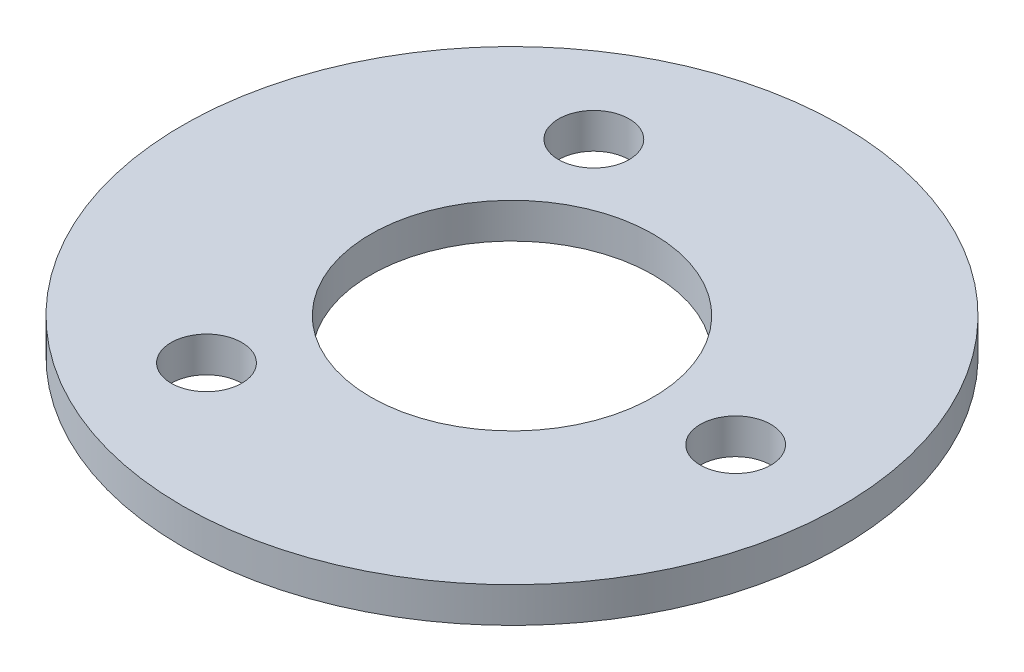
ISO-10303-21;
HEADER;
FILE_DESCRIPTION(('STEP AP214'),'2;1');
FILE_NAME('part.step','',(''),(''),'','','');
FILE_SCHEMA(('AUTOMOTIVE_DESIGN { 1 0 10303 214 1 1 1 1 }'));
ENDSEC;
DATA;
#1=APPLICATION_CONTEXT('core data for automotive mechanical design processes');
#2=APPLICATION_PROTOCOL_DEFINITION('international standard','automotive_design',2000,#1);
#3=PRODUCT_CONTEXT('',#1,'mechanical');
#4=PRODUCT('Part','Part','',(#3));
#5=PRODUCT_RELATED_PRODUCT_CATEGORY('part','',(#4));
#6=PRODUCT_DEFINITION_FORMATION('','',#4);
#7=PRODUCT_DEFINITION_CONTEXT('part definition',#1,'design');
#8=PRODUCT_DEFINITION('design','',#6,#7);
#9=PRODUCT_DEFINITION_SHAPE('','',#8);
#10=(LENGTH_UNIT() NAMED_UNIT(*) SI_UNIT(.MILLI.,.METRE.));
#11=(NAMED_UNIT(*) PLANE_ANGLE_UNIT() SI_UNIT($,.RADIAN.));
#12=(NAMED_UNIT(*) SI_UNIT($,.STERADIAN.) SOLID_ANGLE_UNIT());
#13=UNCERTAINTY_MEASURE_WITH_UNIT(LENGTH_MEASURE(1.E-05),#10,'distance_accuracy_value','');
#14=(GEOMETRIC_REPRESENTATION_CONTEXT(3) GLOBAL_UNCERTAINTY_ASSIGNED_CONTEXT((#13)) GLOBAL_UNIT_ASSIGNED_CONTEXT((#10,
#11,#12)) REPRESENTATION_CONTEXT('',''));
#15=CARTESIAN_POINT('',(0.,0.,0.));
#16=DIRECTION('',(0.,0.,1.));
#17=DIRECTION('',(1.,0.,0.));
#18=AXIS2_PLACEMENT_3D('',#15,#16,#17);
#19=CARTESIAN_POINT('',(0.,1.5,0.));
#20=DIRECTION('',(0.,1.,0.));
#21=DIRECTION('',(0.,0.,1.));
#22=AXIS2_PLACEMENT_3D('',#19,#20,#21);
#23=PLANE('',#22);
#24=CARTESIAN_POINT('',(9.5,1.5,0.));
#25=DIRECTION('',(0.,1.,0.));
#26=DIRECTION('',(0.,0.,1.));
#27=AXIS2_PLACEMENT_3D('',#24,#25,#26);
#28=CIRCLE('',#27,1.5);
#29=CARTESIAN_POINT('',(9.5,1.5,1.5));
#30=VERTEX_POINT('',#29);
#31=EDGE_CURVE('E62',#30,#30,#28,.T.);
#32=ORIENTED_EDGE('',*,*,#31,.F.);
#33=EDGE_LOOP('',(#32));
#34=FACE_BOUND('',#33,.T.);
#35=CARTESIAN_POINT('',(-4.75000000000004,1.5,8.22724133595215));
#36=DIRECTION('',(0.,1.,0.));
#37=DIRECTION('',(0.,0.,1.));
#38=AXIS2_PLACEMENT_3D('',#35,#36,#37);
#39=CIRCLE('',#38,1.5);
#40=CARTESIAN_POINT('',(-4.75000000000004,1.5,9.72724133595215));
#41=VERTEX_POINT('',#40);
#42=EDGE_CURVE('E70',#41,#41,#39,.T.);
#43=ORIENTED_EDGE('',*,*,#42,.F.);
#44=EDGE_LOOP('',(#43));
#45=FACE_BOUND('',#44,.T.);
#46=CARTESIAN_POINT('',(-4.74999999999993,1.5,-8.22724133595221));
#47=DIRECTION('',(0.,1.,0.));
#48=DIRECTION('',(0.,0.,1.));
#49=AXIS2_PLACEMENT_3D('',#46,#47,#48);
#50=CIRCLE('',#49,1.5);
#51=CARTESIAN_POINT('',(-4.74999999999993,1.5,-6.72724133595221));
#52=VERTEX_POINT('',#51);
#53=EDGE_CURVE('E71',#52,#52,#50,.T.);
#54=ORIENTED_EDGE('',*,*,#53,.F.);
#55=EDGE_LOOP('',(#54));
#56=FACE_BOUND('',#55,.T.);
#57=CARTESIAN_POINT('',(0.,1.5,0.));
#58=DIRECTION('',(0.,1.,0.));
#59=DIRECTION('',(0.,0.,1.));
#60=AXIS2_PLACEMENT_3D('',#57,#58,#59);
#61=CIRCLE('',#60,14.);
#62=CARTESIAN_POINT('',(0.,1.5,14.));
#63=VERTEX_POINT('',#62);
#64=EDGE_CURVE('E10',#63,#63,#61,.T.);
#65=ORIENTED_EDGE('',*,*,#64,.T.);
#66=EDGE_LOOP('',(#65));
#67=FACE_BOUND('',#66,.T.);
#68=CARTESIAN_POINT('',(0.,1.5,0.));
#69=DIRECTION('',(0.,1.,0.));
#70=DIRECTION('',(0.,0.,1.));
#71=AXIS2_PLACEMENT_3D('',#68,#69,#70);
#72=CIRCLE('',#71,6.);
#73=CARTESIAN_POINT('',(0.,1.5,6.));
#74=VERTEX_POINT('',#73);
#75=EDGE_CURVE('E56',#74,#74,#72,.T.);
#76=ORIENTED_EDGE('',*,*,#75,.F.);
#77=EDGE_LOOP('',(#76));
#78=FACE_BOUND('',#77,.T.);
#79=ADVANCED_FACE('F43',(#34,#45,#56,#67,#78),#23,.T.);
#80=CARTESIAN_POINT('',(0.,0.,0.));
#81=DIRECTION('',(0.,1.,0.));
#82=DIRECTION('',(0.,0.,1.));
#83=AXIS2_PLACEMENT_3D('',#80,#81,#82);
#84=PLANE('',#83);
#85=CARTESIAN_POINT('',(9.5,0.,0.));
#86=DIRECTION('',(0.,1.,0.));
#87=DIRECTION('',(0.,0.,1.));
#88=AXIS2_PLACEMENT_3D('',#85,#86,#87);
#89=CIRCLE('',#88,1.5);
#90=CARTESIAN_POINT('',(9.5,0.,1.5));
#91=VERTEX_POINT('',#90);
#92=EDGE_CURVE('E79',#91,#91,#89,.T.);
#93=ORIENTED_EDGE('',*,*,#92,.T.);
#94=EDGE_LOOP('',(#93));
#95=FACE_BOUND('',#94,.T.);
#96=CARTESIAN_POINT('',(-4.75000000000004,0.,8.22724133595215));
#97=DIRECTION('',(0.,1.,0.));
#98=DIRECTION('',(0.,0.,1.));
#99=AXIS2_PLACEMENT_3D('',#96,#97,#98);
#100=CIRCLE('',#99,1.5);
#101=CARTESIAN_POINT('',(-4.75000000000004,0.,9.72724133595215));
#102=VERTEX_POINT('',#101);
#103=EDGE_CURVE('E75',#102,#102,#100,.T.);
#104=ORIENTED_EDGE('',*,*,#103,.T.);
#105=EDGE_LOOP('',(#104));
#106=FACE_BOUND('',#105,.T.);
#107=CARTESIAN_POINT('',(-4.74999999999993,0.,-8.22724133595221));
#108=DIRECTION('',(0.,1.,0.));
#109=DIRECTION('',(0.,0.,1.));
#110=AXIS2_PLACEMENT_3D('',#107,#108,#109);
#111=CIRCLE('',#110,1.5);
#112=CARTESIAN_POINT('',(-4.74999999999993,0.,-6.72724133595221));
#113=VERTEX_POINT('',#112);
#114=EDGE_CURVE('E66',#113,#113,#111,.T.);
#115=ORIENTED_EDGE('',*,*,#114,.T.);
#116=EDGE_LOOP('',(#115));
#117=FACE_BOUND('',#116,.T.);
#118=CARTESIAN_POINT('',(0.,0.,0.));
#119=DIRECTION('',(0.,1.,0.));
#120=DIRECTION('',(0.,0.,1.));
#121=AXIS2_PLACEMENT_3D('',#118,#119,#120);
#122=CIRCLE('',#121,14.);
#123=CARTESIAN_POINT('',(0.,0.,14.));
#124=VERTEX_POINT('',#123);
#125=EDGE_CURVE('E47',#124,#124,#122,.T.);
#126=ORIENTED_EDGE('',*,*,#125,.F.);
#127=EDGE_LOOP('',(#126));
#128=FACE_BOUND('',#127,.T.);
#129=CARTESIAN_POINT('',(0.,0.,0.));
#130=DIRECTION('',(0.,1.,0.));
#131=DIRECTION('',(0.,0.,1.));
#132=AXIS2_PLACEMENT_3D('',#129,#130,#131);
#133=CIRCLE('',#132,6.);
#134=CARTESIAN_POINT('',(0.,0.,6.));
#135=VERTEX_POINT('',#134);
#136=EDGE_CURVE('E58',#135,#135,#133,.T.);
#137=ORIENTED_EDGE('',*,*,#136,.T.);
#138=EDGE_LOOP('',(#137));
#139=FACE_BOUND('',#138,.T.);
#140=ADVANCED_FACE('F90',(#95,#106,#117,#128,#139),#84,.F.);
#141=CARTESIAN_POINT('',(0.,1.5,0.));
#142=DIRECTION('',(0.,-1.,0.));
#143=DIRECTION('',(0.,0.,-1.));
#144=AXIS2_PLACEMENT_3D('',#141,#142,#143);
#145=CYLINDRICAL_SURFACE('',#144,14.);
#146=ORIENTED_EDGE('',*,*,#64,.F.);
#147=EDGE_LOOP('',(#146));
#148=FACE_BOUND('',#147,.T.);
#149=ORIENTED_EDGE('',*,*,#125,.T.);
#150=EDGE_LOOP('',(#149));
#151=FACE_BOUND('',#150,.T.);
#152=ADVANCED_FACE('F45',(#148,#151),#145,.T.);
#153=CARTESIAN_POINT('',(0.,1.5,0.));
#154=DIRECTION('',(0.,-1.,0.));
#155=DIRECTION('',(0.,0.,-1.));
#156=AXIS2_PLACEMENT_3D('',#153,#154,#155);
#157=CYLINDRICAL_SURFACE('',#156,6.);
#158=ORIENTED_EDGE('',*,*,#75,.T.);
#159=EDGE_LOOP('',(#158));
#160=FACE_BOUND('',#159,.T.);
#161=ORIENTED_EDGE('',*,*,#136,.F.);
#162=EDGE_LOOP('',(#161));
#163=FACE_BOUND('',#162,.T.);
#164=ADVANCED_FACE('F114',(#160,#163),#157,.F.);
#165=CARTESIAN_POINT('',(-4.74999999999993,1.501,-8.22724133595221));
#166=DIRECTION('',(0.,-1.,0.));
#167=DIRECTION('',(0.,0.,-1.));
#168=AXIS2_PLACEMENT_3D('',#165,#166,#167);
#169=CYLINDRICAL_SURFACE('',#168,1.5);
#170=ORIENTED_EDGE('',*,*,#53,.T.);
#171=EDGE_LOOP('',(#170));
#172=FACE_BOUND('',#171,.T.);
#173=ORIENTED_EDGE('',*,*,#114,.F.);
#174=EDGE_LOOP('',(#173));
#175=FACE_BOUND('',#174,.T.);
#176=ADVANCED_FACE('F101',(#172,#175),#169,.F.);
#177=CARTESIAN_POINT('',(-4.75000000000004,1.501,8.22724133595215));
#178=DIRECTION('',(0.,-1.,0.));
#179=DIRECTION('',(0.,0.,-1.));
#180=AXIS2_PLACEMENT_3D('',#177,#178,#179);
#181=CYLINDRICAL_SURFACE('',#180,1.5);
#182=ORIENTED_EDGE('',*,*,#42,.T.);
#183=EDGE_LOOP('',(#182));
#184=FACE_BOUND('',#183,.T.);
#185=ORIENTED_EDGE('',*,*,#103,.F.);
#186=EDGE_LOOP('',(#185));
#187=FACE_BOUND('',#186,.T.);
#188=ADVANCED_FACE('F95',(#184,#187),#181,.F.);
#189=CARTESIAN_POINT('',(9.5,1.501,0.));
#190=DIRECTION('',(0.,-1.,0.));
#191=DIRECTION('',(0.,0.,-1.));
#192=AXIS2_PLACEMENT_3D('',#189,#190,#191);
#193=CYLINDRICAL_SURFACE('',#192,1.5);
#194=ORIENTED_EDGE('',*,*,#31,.T.);
#195=EDGE_LOOP('',(#194));
#196=FACE_BOUND('',#195,.T.);
#197=ORIENTED_EDGE('',*,*,#92,.F.);
#198=EDGE_LOOP('',(#197));
#199=FACE_BOUND('',#198,.T.);
#200=ADVANCED_FACE('F93',(#196,#199),#193,.F.);
#201=CLOSED_SHELL('',(#79,#140,#152,#164,#176,#188,#200));
#202=MANIFOLD_SOLID_BREP('B2',#201);
#203=ADVANCED_BREP_SHAPE_REPRESENTATION('',(#18,#202),#14);
#204=SHAPE_DEFINITION_REPRESENTATION(#9,#203);
ENDSEC;
END-ISO-10303-21;
